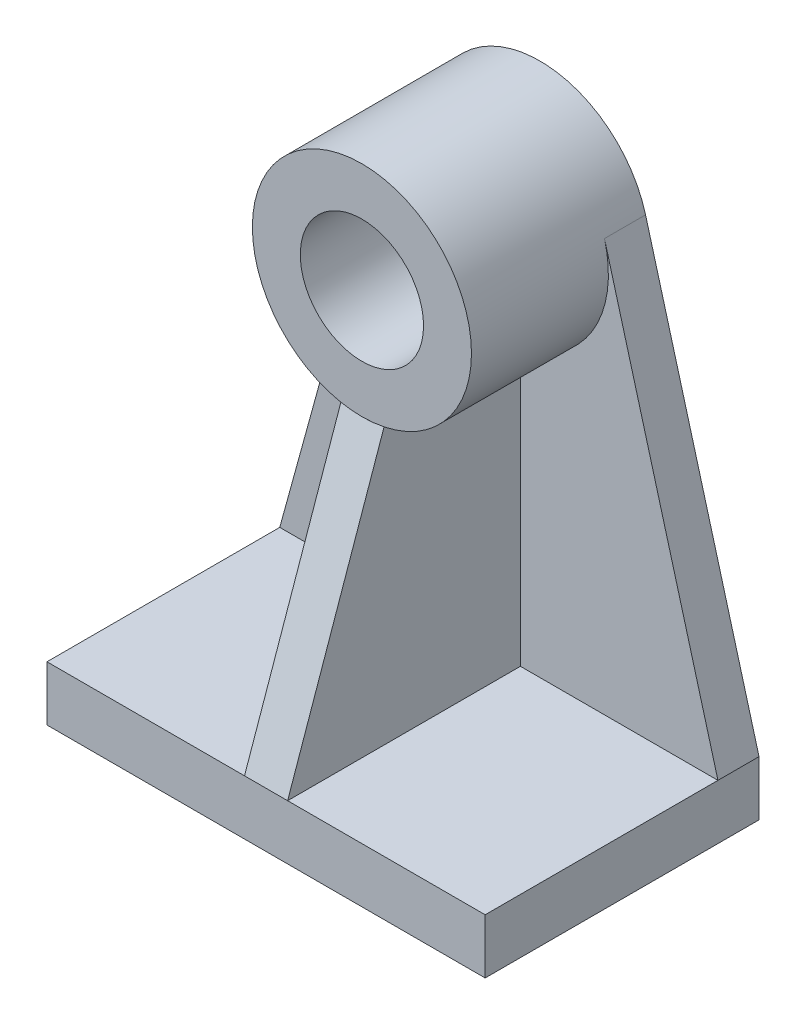
ISO-10303-21;
HEADER;
FILE_DESCRIPTION(('STEP AP214'),'2;1');
FILE_NAME('part.step','',(''),(''),'','','');
FILE_SCHEMA(('AUTOMOTIVE_DESIGN { 1 0 10303 214 1 1 1 1 }'));
ENDSEC;
DATA;
#1=APPLICATION_CONTEXT('core data for automotive mechanical design processes');
#2=APPLICATION_PROTOCOL_DEFINITION('international standard','automotive_design',2000,#1);
#3=PRODUCT_CONTEXT('',#1,'mechanical');
#4=PRODUCT('Part','Part','',(#3));
#5=PRODUCT_RELATED_PRODUCT_CATEGORY('part','',(#4));
#6=PRODUCT_DEFINITION_FORMATION('','',#4);
#7=PRODUCT_DEFINITION_CONTEXT('part definition',#1,'design');
#8=PRODUCT_DEFINITION('design','',#6,#7);
#9=PRODUCT_DEFINITION_SHAPE('','',#8);
#10=(LENGTH_UNIT() NAMED_UNIT(*) SI_UNIT(.MILLI.,.METRE.));
#11=(NAMED_UNIT(*) PLANE_ANGLE_UNIT() SI_UNIT($,.RADIAN.));
#12=(NAMED_UNIT(*) SI_UNIT($,.STERADIAN.) SOLID_ANGLE_UNIT());
#13=UNCERTAINTY_MEASURE_WITH_UNIT(LENGTH_MEASURE(1.E-05),#10,'distance_accuracy_value','');
#14=(GEOMETRIC_REPRESENTATION_CONTEXT(3) GLOBAL_UNCERTAINTY_ASSIGNED_CONTEXT((#13)) GLOBAL_UNIT_ASSIGNED_CONTEXT((#10,
#11,#12)) REPRESENTATION_CONTEXT('',''));
#15=CARTESIAN_POINT('',(0.,0.,0.));
#16=DIRECTION('',(0.,0.,1.));
#17=DIRECTION('',(1.,0.,0.));
#18=AXIS2_PLACEMENT_3D('',#15,#16,#17);
#19=CARTESIAN_POINT('',(0.,0.,9.525));
#20=DIRECTION('',(0.,0.,1.));
#21=DIRECTION('',(1.,0.,0.));
#22=AXIS2_PLACEMENT_3D('',#19,#20,#21);
#23=PLANE('',#22);
#24=DIRECTION('',(-1.,0.,0.));
#25=VECTOR('',#24,1.);
#26=CARTESIAN_POINT('',(-50.8,-88.9,9.525));
#27=LINE('',#26,#25);
#28=CARTESIAN_POINT('',(-5.,-88.9,9.52500000000001));
#29=VERTEX_POINT('',#28);
#30=CARTESIAN_POINT('',(-50.8,-88.9,9.525));
#31=VERTEX_POINT('',#30);
#32=EDGE_CURVE('E143',#29,#31,#27,.T.);
#33=ORIENTED_EDGE('',*,*,#32,.F.);
#34=DIRECTION('',(0.,1.,0.));
#35=VECTOR('',#34,1.);
#36=CARTESIAN_POINT('',(-5.,0.,9.525));
#37=LINE('',#36,#35);
#38=CARTESIAN_POINT('',(-5.,-24.9030118660374,9.525));
#39=VERTEX_POINT('',#38);
#40=EDGE_CURVE('E191',#29,#39,#37,.T.);
#41=ORIENTED_EDGE('',*,*,#40,.T.);
#42=CARTESIAN_POINT('',(0.,0.,9.525));
#43=DIRECTION('',(0.,0.,1.));
#44=DIRECTION('',(1.,0.,0.));
#45=AXIS2_PLACEMENT_3D('',#42,#43,#44);
#46=CIRCLE('',#45,25.4);
#47=CARTESIAN_POINT('',(-24.4901906519416,6.73725180110948,9.525));
#48=VERTEX_POINT('',#47);
#49=EDGE_CURVE('E40',#39,#48,#46,.F.);
#50=ORIENTED_EDGE('',*,*,#49,.T.);
#51=DIRECTION('',(-0.265246133901948,-0.964180734328409,0.));
#52=VECTOR('',#51,1.);
#53=CARTESIAN_POINT('',(-50.8,-88.9,9.525));
#54=LINE('',#53,#52);
#55=EDGE_CURVE('E93',#48,#31,#54,.T.);
#56=ORIENTED_EDGE('',*,*,#55,.T.);
#57=EDGE_LOOP('',(#33,#41,#50,#56));
#58=FACE_BOUND('',#57,.T.);
#59=ADVANCED_FACE('F32',(#58),#23,.T.);
#60=CARTESIAN_POINT('',(-50.8,-88.9,63.5));
#61=DIRECTION('',(0.,-1.,0.));
#62=DIRECTION('',(1.,0.,0.));
#63=AXIS2_PLACEMENT_3D('',#60,#61,#62);
#64=PLANE('',#63);
#65=DIRECTION('',(0.,0.,1.));
#66=VECTOR('',#65,1.);
#67=CARTESIAN_POINT('',(-5.,-88.9,63.5));
#68=LINE('',#67,#66);
#69=CARTESIAN_POINT('',(-5.,-88.9,63.5));
#70=VERTEX_POINT('',#69);
#71=EDGE_CURVE('E193',#29,#70,#68,.T.);
#72=ORIENTED_EDGE('',*,*,#71,.F.);
#73=ORIENTED_EDGE('',*,*,#32,.T.);
#74=DIRECTION('',(0.,0.,-1.));
#75=VECTOR('',#74,1.);
#76=CARTESIAN_POINT('',(-50.8,-88.9,63.5));
#77=LINE('',#76,#75);
#78=CARTESIAN_POINT('',(-50.8,-88.9,63.5));
#79=VERTEX_POINT('',#78);
#80=EDGE_CURVE('E112',#79,#31,#77,.T.);
#81=ORIENTED_EDGE('',*,*,#80,.F.);
#82=DIRECTION('',(-1.,0.,0.));
#83=VECTOR('',#82,1.);
#84=CARTESIAN_POINT('',(-50.8,-88.9,63.5));
#85=LINE('',#84,#83);
#86=EDGE_CURVE('E157',#70,#79,#85,.T.);
#87=ORIENTED_EDGE('',*,*,#86,.F.);
#88=EDGE_LOOP('',(#72,#73,#81,#87));
#89=FACE_BOUND('',#88,.T.);
#90=ADVANCED_FACE('F231',(#89),#64,.F.);
#91=DIRECTION('',(0.,1.,0.));
#92=VECTOR('',#91,1.);
#93=CARTESIAN_POINT('',(5.,0.,9.525));
#94=LINE('',#93,#92);
#95=CARTESIAN_POINT('',(5.,-88.9,9.52500000000001));
#96=VERTEX_POINT('',#95);
#97=CARTESIAN_POINT('',(5.,-24.9030118660374,9.525));
#98=VERTEX_POINT('',#97);
#99=EDGE_CURVE('E182',#96,#98,#94,.T.);
#100=ORIENTED_EDGE('',*,*,#99,.F.);
#101=CARTESIAN_POINT('',(50.8,-88.9,9.525));
#102=VERTEX_POINT('',#101);
#103=EDGE_CURVE('E148',#102,#96,#27,.T.);
#104=ORIENTED_EDGE('',*,*,#103,.F.);
#105=DIRECTION('',(-0.265246133901948,0.964180734328409,0.));
#106=VECTOR('',#105,1.);
#107=CARTESIAN_POINT('',(50.8,-88.9,9.525));
#108=LINE('',#107,#106);
#109=CARTESIAN_POINT('',(24.4901906519416,6.73725180110948,9.525));
#110=VERTEX_POINT('',#109);
#111=EDGE_CURVE('E100',#102,#110,#108,.T.);
#112=ORIENTED_EDGE('',*,*,#111,.T.);
#113=EDGE_CURVE('E11',#110,#98,#46,.F.);
#114=ORIENTED_EDGE('',*,*,#113,.T.);
#115=EDGE_LOOP('',(#100,#104,#112,#114));
#116=FACE_BOUND('',#115,.T.);
#117=ADVANCED_FACE('F233',(#116),#23,.T.);
#118=CARTESIAN_POINT('',(-50.8,-88.9,9.525));
#119=DIRECTION('',(0.964180734328409,-0.265246133901948,0.));
#120=DIRECTION('',(0.265246133901948,0.964180734328409,0.));
#121=AXIS2_PLACEMENT_3D('',#118,#119,#120);
#122=PLANE('',#121);
#123=DIRECTION('',(-0.265246133901948,-0.964180734328409,0.));
#124=VECTOR('',#123,1.);
#125=CARTESIAN_POINT('',(-50.8,-88.9,0.));
#126=LINE('',#125,#124);
#127=CARTESIAN_POINT('',(-24.4901906519416,6.73725180110948,0.));
#128=VERTEX_POINT('',#127);
#129=CARTESIAN_POINT('',(-50.8,-88.9,0.));
#130=VERTEX_POINT('',#129);
#131=EDGE_CURVE('E99',#128,#130,#126,.T.);
#132=ORIENTED_EDGE('',*,*,#131,.T.);
#133=DIRECTION('',(0.,0.,-1.));
#134=VECTOR('',#133,1.);
#135=CARTESIAN_POINT('',(-50.8,-88.9,9.525));
#136=LINE('',#135,#134);
#137=EDGE_CURVE('E130',#31,#130,#136,.T.);
#138=ORIENTED_EDGE('',*,*,#137,.F.);
#139=ORIENTED_EDGE('',*,*,#55,.F.);
#140=DIRECTION('',(0.,0.,-1.));
#141=VECTOR('',#140,1.);
#142=CARTESIAN_POINT('',(-24.4901906519416,6.73725180110948,9.525));
#143=LINE('',#142,#141);
#144=EDGE_CURVE('E85',#48,#128,#143,.T.);
#145=ORIENTED_EDGE('',*,*,#144,.T.);
#146=EDGE_LOOP('',(#132,#138,#139,#145));
#147=FACE_BOUND('',#146,.T.);
#148=ADVANCED_FACE('F34',(#147),#122,.F.);
#149=CARTESIAN_POINT('',(-50.8,-101.6,9.525));
#150=DIRECTION('',(1.,0.,0.));
#151=DIRECTION('',(0.,1.,0.));
#152=AXIS2_PLACEMENT_3D('',#149,#150,#151);
#153=PLANE('',#152);
#154=DIRECTION('',(0.,-1.,0.));
#155=VECTOR('',#154,1.);
#156=CARTESIAN_POINT('',(-50.8,-101.6,0.));
#157=LINE('',#156,#155);
#158=CARTESIAN_POINT('',(-50.8,-101.6,0.));
#159=VERTEX_POINT('',#158);
#160=EDGE_CURVE('E105',#130,#159,#157,.T.);
#161=ORIENTED_EDGE('',*,*,#160,.T.);
#162=DIRECTION('',(0.,0.,-1.));
#163=VECTOR('',#162,1.);
#164=CARTESIAN_POINT('',(-50.8,-101.6,9.525));
#165=LINE('',#164,#163);
#166=CARTESIAN_POINT('',(-50.8,-101.6,63.5));
#167=VERTEX_POINT('',#166);
#168=EDGE_CURVE('E128',#167,#159,#165,.T.);
#169=ORIENTED_EDGE('',*,*,#168,.F.);
#170=DIRECTION('',(0.,-1.,0.));
#171=VECTOR('',#170,1.);
#172=CARTESIAN_POINT('',(-50.8,-88.9,63.5));
#173=LINE('',#172,#171);
#174=EDGE_CURVE('E147',#79,#167,#173,.T.);
#175=ORIENTED_EDGE('',*,*,#174,.F.);
#176=ORIENTED_EDGE('',*,*,#80,.T.);
#177=ORIENTED_EDGE('',*,*,#137,.T.);
#178=EDGE_LOOP('',(#161,#169,#175,#176,#177));
#179=FACE_BOUND('',#178,.T.);
#180=ADVANCED_FACE('F133',(#179),#153,.F.);
#181=CARTESIAN_POINT('',(-50.8,-101.6,9.525));
#182=DIRECTION('',(0.,1.,0.));
#183=DIRECTION('',(-1.,0.,0.));
#184=AXIS2_PLACEMENT_3D('',#181,#182,#183);
#185=PLANE('',#184);
#186=DIRECTION('',(0.,0.,-1.));
#187=VECTOR('',#186,1.);
#188=CARTESIAN_POINT('',(50.8,-101.6,9.525));
#189=LINE('',#188,#187);
#190=CARTESIAN_POINT('',(50.8,-101.6,63.5));
#191=VERTEX_POINT('',#190);
#192=CARTESIAN_POINT('',(50.8,-101.6,0.));
#193=VERTEX_POINT('',#192);
#194=EDGE_CURVE('E125',#191,#193,#189,.T.);
#195=ORIENTED_EDGE('',*,*,#194,.F.);
#196=DIRECTION('',(1.,0.,0.));
#197=VECTOR('',#196,1.);
#198=CARTESIAN_POINT('',(-50.8,-101.6,63.5));
#199=LINE('',#198,#197);
#200=EDGE_CURVE('E151',#167,#191,#199,.T.);
#201=ORIENTED_EDGE('',*,*,#200,.F.);
#202=ORIENTED_EDGE('',*,*,#168,.T.);
#203=DIRECTION('',(1.,0.,0.));
#204=VECTOR('',#203,1.);
#205=CARTESIAN_POINT('',(-50.8,-101.6,0.));
#206=LINE('',#205,#204);
#207=EDGE_CURVE('E109',#159,#193,#206,.T.);
#208=ORIENTED_EDGE('',*,*,#207,.T.);
#209=EDGE_LOOP('',(#195,#201,#202,#208));
#210=FACE_BOUND('',#209,.T.);
#211=ADVANCED_FACE('F267',(#210),#185,.F.);
#212=CARTESIAN_POINT('',(50.8,-101.6,9.525));
#213=DIRECTION('',(-1.,0.,0.));
#214=DIRECTION('',(0.,0.,1.));
#215=AXIS2_PLACEMENT_3D('',#212,#213,#214);
#216=PLANE('',#215);
#217=DIRECTION('',(0.,1.,0.));
#218=VECTOR('',#217,1.);
#219=CARTESIAN_POINT('',(50.8,-101.6,0.));
#220=LINE('',#219,#218);
#221=CARTESIAN_POINT('',(50.8,-88.9,0.));
#222=VERTEX_POINT('',#221);
#223=EDGE_CURVE('E118',#193,#222,#220,.T.);
#224=ORIENTED_EDGE('',*,*,#223,.T.);
#225=DIRECTION('',(0.,0.,-1.));
#226=VECTOR('',#225,1.);
#227=CARTESIAN_POINT('',(50.8,-88.9,9.525));
#228=LINE('',#227,#226);
#229=EDGE_CURVE('E122',#102,#222,#228,.T.);
#230=ORIENTED_EDGE('',*,*,#229,.F.);
#231=DIRECTION('',(0.,0.,-1.));
#232=VECTOR('',#231,1.);
#233=CARTESIAN_POINT('',(50.8,-88.9,63.5));
#234=LINE('',#233,#232);
#235=CARTESIAN_POINT('',(50.8,-88.9,63.5));
#236=VERTEX_POINT('',#235);
#237=EDGE_CURVE('E107',#236,#102,#234,.T.);
#238=ORIENTED_EDGE('',*,*,#237,.F.);
#239=DIRECTION('',(0.,1.,0.));
#240=VECTOR('',#239,1.);
#241=CARTESIAN_POINT('',(50.8,-101.6,63.5));
#242=LINE('',#241,#240);
#243=EDGE_CURVE('E158',#191,#236,#242,.T.);
#244=ORIENTED_EDGE('',*,*,#243,.F.);
#245=ORIENTED_EDGE('',*,*,#194,.T.);
#246=EDGE_LOOP('',(#224,#230,#238,#244,#245));
#247=FACE_BOUND('',#246,.T.);
#248=ADVANCED_FACE('F254',(#247),#216,.F.);
#249=CARTESIAN_POINT('',(50.8,-88.9,9.525));
#250=DIRECTION('',(-0.964180734328409,-0.265246133901948,0.));
#251=DIRECTION('',(0.265246133901948,-0.964180734328409,0.));
#252=AXIS2_PLACEMENT_3D('',#249,#250,#251);
#253=PLANE('',#252);
#254=DIRECTION('',(-0.265246133901948,0.964180734328409,0.));
#255=VECTOR('',#254,1.);
#256=CARTESIAN_POINT('',(50.8,-88.9,0.));
#257=LINE('',#256,#255);
#258=CARTESIAN_POINT('',(24.4901906519416,6.73725180110949,0.));
#259=VERTEX_POINT('',#258);
#260=EDGE_CURVE('E94',#222,#259,#257,.T.);
#261=ORIENTED_EDGE('',*,*,#260,.T.);
#262=DIRECTION('',(0.,0.,-1.));
#263=VECTOR('',#262,1.);
#264=CARTESIAN_POINT('',(24.4901906519416,6.73725180110949,9.525));
#265=LINE('',#264,#263);
#266=EDGE_CURVE('E89',#110,#259,#265,.T.);
#267=ORIENTED_EDGE('',*,*,#266,.F.);
#268=ORIENTED_EDGE('',*,*,#111,.F.);
#269=ORIENTED_EDGE('',*,*,#229,.T.);
#270=EDGE_LOOP('',(#261,#267,#268,#269));
#271=FACE_BOUND('',#270,.T.);
#272=ADVANCED_FACE('F269',(#271),#253,.F.);
#273=CARTESIAN_POINT('',(0.,0.,9.525));
#274=DIRECTION('',(0.,0.,-1.));
#275=DIRECTION('',(-1.,0.,0.));
#276=AXIS2_PLACEMENT_3D('',#273,#274,#275);
#277=CYLINDRICAL_SURFACE('',#276,25.4);
#278=CARTESIAN_POINT('',(0.,0.,32.385));
#279=DIRECTION('',(0.,-0.330350424728106,-0.943858356366018));
#280=DIRECTION('',(0.,0.943858356366018,-0.330350424728106));
#281=AXIS2_PLACEMENT_3D('',#278,#279,#280);
#282=ELLIPSE('',#281,26.9108175275297,25.4);
#283=CARTESIAN_POINT('',(0.,-25.4,41.275));
#284=VERTEX_POINT('',#283);
#285=CARTESIAN_POINT('',(5.,-24.9030118660374,41.1010541531131));
#286=VERTEX_POINT('',#285);
#287=EDGE_CURVE('E175',#284,#286,#282,.F.);
#288=ORIENTED_EDGE('',*,*,#287,.T.);
#289=DIRECTION('',(0.,0.,-1.));
#290=VECTOR('',#289,1.);
#291=CARTESIAN_POINT('',(5.,-24.9030118660374,9.525));
#292=LINE('',#291,#290);
#293=EDGE_CURVE('E179',#286,#98,#292,.T.);
#294=ORIENTED_EDGE('',*,*,#293,.T.);
#295=ORIENTED_EDGE('',*,*,#113,.F.);
#296=ORIENTED_EDGE('',*,*,#266,.T.);
#297=CARTESIAN_POINT('',(0.,0.,0.));
#298=DIRECTION('',(0.,0.,1.));
#299=DIRECTION('',(1.,0.,0.));
#300=AXIS2_PLACEMENT_3D('',#297,#298,#299);
#301=CIRCLE('',#300,25.4);
#302=EDGE_CURVE('E81',#259,#128,#301,.T.);
#303=ORIENTED_EDGE('',*,*,#302,.T.);
#304=ORIENTED_EDGE('',*,*,#144,.F.);
#305=ORIENTED_EDGE('',*,*,#49,.F.);
#306=DIRECTION('',(0.,0.,-1.));
#307=VECTOR('',#306,1.);
#308=CARTESIAN_POINT('',(-5.,-24.9030118660374,9.525));
#309=LINE('',#308,#307);
#310=CARTESIAN_POINT('',(-5.,-24.9030118660374,41.1010541531131));
#311=VERTEX_POINT('',#310);
#312=EDGE_CURVE('E188',#311,#39,#309,.T.);
#313=ORIENTED_EDGE('',*,*,#312,.F.);
#314=EDGE_CURVE('E170',#311,#284,#282,.F.);
#315=ORIENTED_EDGE('',*,*,#314,.T.);
#316=CARTESIAN_POINT('',(0.,0.,41.275));
#317=DIRECTION('',(0.,0.,1.));
#318=DIRECTION('',(1.,0.,0.));
#319=AXIS2_PLACEMENT_3D('',#316,#317,#318);
#320=CIRCLE('',#319,25.4);
#321=EDGE_CURVE('E163',#284,#284,#320,.T.);
#322=ORIENTED_EDGE('',*,*,#321,.F.);
#323=EDGE_LOOP('',(#288,#294,#295,#296,#303,#304,#305,#313,#315,#322));
#324=FACE_BOUND('',#323,.T.);
#325=ADVANCED_FACE('F84',(#324),#277,.T.);
#326=CARTESIAN_POINT('',(0.,0.,0.));
#327=DIRECTION('',(0.,0.,1.));
#328=DIRECTION('',(1.,0.,0.));
#329=AXIS2_PLACEMENT_3D('',#326,#327,#328);
#330=PLANE('',#329);
#331=CARTESIAN_POINT('',(0.,0.,0.));
#332=DIRECTION('',(0.,0.,1.));
#333=DIRECTION('',(1.,0.,0.));
#334=AXIS2_PLACEMENT_3D('',#331,#332,#333);
#335=CIRCLE('',#334,14.2875);
#336=CARTESIAN_POINT('',(14.2875,0.,0.));
#337=VERTEX_POINT('',#336);
#338=EDGE_CURVE('E166',#337,#337,#335,.T.);
#339=ORIENTED_EDGE('',*,*,#338,.T.);
#340=EDGE_LOOP('',(#339));
#341=FACE_BOUND('',#340,.T.);
#342=ORIENTED_EDGE('',*,*,#223,.F.);
#343=ORIENTED_EDGE('',*,*,#207,.F.);
#344=ORIENTED_EDGE('',*,*,#160,.F.);
#345=ORIENTED_EDGE('',*,*,#131,.F.);
#346=ORIENTED_EDGE('',*,*,#302,.F.);
#347=ORIENTED_EDGE('',*,*,#260,.F.);
#348=EDGE_LOOP('',(#342,#343,#344,#345,#346,#347));
#349=FACE_BOUND('',#348,.T.);
#350=ADVANCED_FACE('F103',(#341,#349),#330,.F.);
#351=ORIENTED_EDGE('',*,*,#103,.T.);
#352=DIRECTION('',(0.,0.,1.));
#353=VECTOR('',#352,1.);
#354=CARTESIAN_POINT('',(5.,-88.9,63.5));
#355=LINE('',#354,#353);
#356=CARTESIAN_POINT('',(5.,-88.9,63.5));
#357=VERTEX_POINT('',#356);
#358=EDGE_CURVE('E185',#96,#357,#355,.T.);
#359=ORIENTED_EDGE('',*,*,#358,.T.);
#360=EDGE_CURVE('E154',#236,#357,#85,.T.);
#361=ORIENTED_EDGE('',*,*,#360,.F.);
#362=ORIENTED_EDGE('',*,*,#237,.T.);
#363=EDGE_LOOP('',(#351,#359,#361,#362));
#364=FACE_BOUND('',#363,.T.);
#365=ADVANCED_FACE('F226',(#364),#64,.F.);
#366=CARTESIAN_POINT('',(50.8,-101.6,63.5));
#367=DIRECTION('',(0.,0.,1.));
#368=DIRECTION('',(1.,0.,0.));
#369=AXIS2_PLACEMENT_3D('',#366,#367,#368);
#370=PLANE('',#369);
#371=ORIENTED_EDGE('',*,*,#360,.T.);
#372=DIRECTION('',(1.,0.,0.));
#373=VECTOR('',#372,1.);
#374=CARTESIAN_POINT('',(50.8,-88.9,63.5));
#375=LINE('',#374,#373);
#376=EDGE_CURVE('E176',#357,#70,#375,.F.);
#377=ORIENTED_EDGE('',*,*,#376,.T.);
#378=ORIENTED_EDGE('',*,*,#86,.T.);
#379=ORIENTED_EDGE('',*,*,#174,.T.);
#380=ORIENTED_EDGE('',*,*,#200,.T.);
#381=ORIENTED_EDGE('',*,*,#243,.T.);
#382=EDGE_LOOP('',(#371,#377,#378,#379,#380,#381));
#383=FACE_BOUND('',#382,.T.);
#384=ADVANCED_FACE('F217',(#383),#370,.T.);
#385=CARTESIAN_POINT('',(0.,0.,41.275));
#386=DIRECTION('',(0.,0.,1.));
#387=DIRECTION('',(1.,0.,0.));
#388=AXIS2_PLACEMENT_3D('',#385,#386,#387);
#389=PLANE('',#388);
#390=CARTESIAN_POINT('',(0.,0.,41.275));
#391=DIRECTION('',(0.,0.,1.));
#392=DIRECTION('',(1.,0.,0.));
#393=AXIS2_PLACEMENT_3D('',#390,#391,#392);
#394=CIRCLE('',#393,14.2875);
#395=CARTESIAN_POINT('',(14.2875,0.,41.275));
#396=VERTEX_POINT('',#395);
#397=EDGE_CURVE('E167',#396,#396,#394,.T.);
#398=ORIENTED_EDGE('',*,*,#397,.F.);
#399=EDGE_LOOP('',(#398));
#400=FACE_BOUND('',#399,.T.);
#401=ORIENTED_EDGE('',*,*,#321,.T.);
#402=EDGE_LOOP('',(#401));
#403=FACE_BOUND('',#402,.T.);
#404=ADVANCED_FACE('F214',(#400,#403),#389,.T.);
#405=CARTESIAN_POINT('',(0.,0.,0.));
#406=DIRECTION('',(0.,0.,1.));
#407=DIRECTION('',(1.,0.,0.));
#408=AXIS2_PLACEMENT_3D('',#405,#406,#407);
#409=CYLINDRICAL_SURFACE('',#408,14.2875);
#410=ORIENTED_EDGE('',*,*,#338,.F.);
#411=EDGE_LOOP('',(#410));
#412=FACE_BOUND('',#411,.T.);
#413=ORIENTED_EDGE('',*,*,#397,.T.);
#414=EDGE_LOOP('',(#413));
#415=FACE_BOUND('',#414,.T.);
#416=ADVANCED_FACE('F216',(#412,#415),#409,.F.);
#417=CARTESIAN_POINT('',(0.,-88.9,63.5));
#418=DIRECTION('',(0.,-0.330350424728106,-0.943858356366018));
#419=DIRECTION('',(0.,0.943858356366017,-0.330350424728106));
#420=AXIS2_PLACEMENT_3D('',#417,#418,#419);
#421=PLANE('',#420);
#422=ORIENTED_EDGE('',*,*,#314,.F.);
#423=DIRECTION('',(0.,0.943858356366017,-0.330350424728106));
#424=VECTOR('',#423,1.);
#425=CARTESIAN_POINT('',(-5.,-88.9,63.5));
#426=LINE('',#425,#424);
#427=EDGE_CURVE('E47',#70,#311,#426,.T.);
#428=ORIENTED_EDGE('',*,*,#427,.F.);
#429=ORIENTED_EDGE('',*,*,#376,.F.);
#430=DIRECTION('',(0.,0.943858356366017,-0.330350424728106));
#431=VECTOR('',#430,1.);
#432=CARTESIAN_POINT('',(5.,-88.9,63.5));
#433=LINE('',#432,#431);
#434=EDGE_CURVE('E195',#357,#286,#433,.T.);
#435=ORIENTED_EDGE('',*,*,#434,.T.);
#436=ORIENTED_EDGE('',*,*,#287,.F.);
#437=EDGE_LOOP('',(#422,#428,#429,#435,#436));
#438=FACE_BOUND('',#437,.T.);
#439=ADVANCED_FACE('F201',(#438),#421,.F.);
#440=CARTESIAN_POINT('',(5.,-38.1,31.75));
#441=DIRECTION('',(1.,0.,0.));
#442=DIRECTION('',(0.,0.,-1.));
#443=AXIS2_PLACEMENT_3D('',#440,#441,#442);
#444=PLANE('',#443);
#445=ORIENTED_EDGE('',*,*,#293,.F.);
#446=ORIENTED_EDGE('',*,*,#434,.F.);
#447=ORIENTED_EDGE('',*,*,#358,.F.);
#448=ORIENTED_EDGE('',*,*,#99,.T.);
#449=EDGE_LOOP('',(#445,#446,#447,#448));
#450=FACE_BOUND('',#449,.T.);
#451=ADVANCED_FACE('F282',(#450),#444,.T.);
#452=CARTESIAN_POINT('',(-5.,-38.1,31.75));
#453=DIRECTION('',(1.,0.,0.));
#454=DIRECTION('',(0.,0.,-1.));
#455=AXIS2_PLACEMENT_3D('',#452,#453,#454);
#456=PLANE('',#455);
#457=ORIENTED_EDGE('',*,*,#427,.T.);
#458=ORIENTED_EDGE('',*,*,#312,.T.);
#459=ORIENTED_EDGE('',*,*,#40,.F.);
#460=ORIENTED_EDGE('',*,*,#71,.T.);
#461=EDGE_LOOP('',(#457,#458,#459,#460));
#462=FACE_BOUND('',#461,.T.);
#463=ADVANCED_FACE('F279',(#462),#456,.F.);
#464=CLOSED_SHELL('',(#59,#90,#117,#148,#180,#211,#248,#272,#325,#350,#365,#384,#404,#416,#439,
#451,#463));
#465=MANIFOLD_SOLID_BREP('B2',#464);
#466=ADVANCED_BREP_SHAPE_REPRESENTATION('',(#18,#465),#14);
#467=SHAPE_DEFINITION_REPRESENTATION(#9,#466);
ENDSEC;
END-ISO-10303-21;
